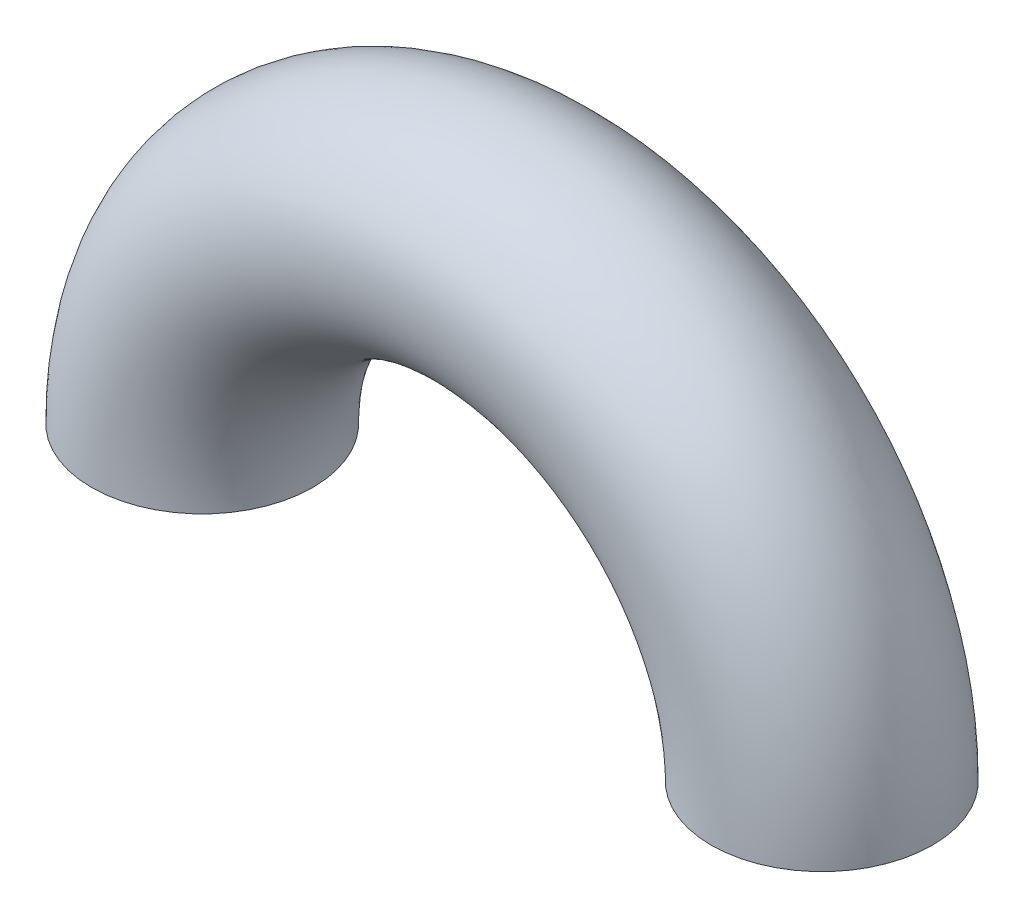
ISO-10303-21;
HEADER;
FILE_DESCRIPTION(('STEP AP214'),'2;1');
FILE_NAME('part.step','',(''),(''),'','','');
FILE_SCHEMA(('AUTOMOTIVE_DESIGN { 1 0 10303 214 1 1 1 1 }'));
ENDSEC;
DATA;
#1=APPLICATION_CONTEXT('core data for automotive mechanical design processes');
#2=APPLICATION_PROTOCOL_DEFINITION('international standard','automotive_design',2000,#1);
#3=PRODUCT_CONTEXT('',#1,'mechanical');
#4=PRODUCT('Part','Part','',(#3));
#5=PRODUCT_RELATED_PRODUCT_CATEGORY('part','',(#4));
#6=PRODUCT_DEFINITION_FORMATION('','',#4);
#7=PRODUCT_DEFINITION_CONTEXT('part definition',#1,'design');
#8=PRODUCT_DEFINITION('design','',#6,#7);
#9=PRODUCT_DEFINITION_SHAPE('','',#8);
#10=(LENGTH_UNIT() NAMED_UNIT(*) SI_UNIT(.MILLI.,.METRE.));
#11=(NAMED_UNIT(*) PLANE_ANGLE_UNIT() SI_UNIT($,.RADIAN.));
#12=(NAMED_UNIT(*) SI_UNIT($,.STERADIAN.) SOLID_ANGLE_UNIT());
#13=UNCERTAINTY_MEASURE_WITH_UNIT(LENGTH_MEASURE(1.E-05),#10,'distance_accuracy_value','');
#14=(GEOMETRIC_REPRESENTATION_CONTEXT(3) GLOBAL_UNCERTAINTY_ASSIGNED_CONTEXT((#13)) GLOBAL_UNIT_ASSIGNED_CONTEXT((#10,
#11,#12)) REPRESENTATION_CONTEXT('',''));
#15=CARTESIAN_POINT('',(0.,0.,0.));
#16=DIRECTION('',(0.,0.,1.));
#17=DIRECTION('',(1.,0.,0.));
#18=AXIS2_PLACEMENT_3D('',#15,#16,#17);
#19=CARTESIAN_POINT('',(-70.,0.,0.));
#20=DIRECTION('',(0.,0.,-1.));
#21=DIRECTION('',(-1.,0.,0.));
#22=AXIS2_PLACEMENT_3D('',#19,#20,#21);
#23=TOROIDAL_SURFACE('',#22,70.,25.);
#24=CARTESIAN_POINT('',(-140.,-4.88807387438039E-13,0.));
#25=DIRECTION('',(0.,-1.,0.));
#26=DIRECTION('',(0.,0.,1.));
#27=AXIS2_PLACEMENT_3D('',#24,#25,#26);
#28=CIRCLE('',#27,25.);
#29=CARTESIAN_POINT('',(-165.,-6.63381454380196E-13,0.));
#30=VERTEX_POINT('',#29);
#31=EDGE_CURVE('E10',#30,#30,#28,.T.);
#32=CARTESIAN_POINT('',(0.,0.,0.));
#33=DIRECTION('',(0.,1.,0.));
#34=DIRECTION('',(0.,0.,1.));
#35=AXIS2_PLACEMENT_3D('',#32,#33,#34);
#36=CIRCLE('',#35,25.);
#37=CARTESIAN_POINT('',(25.,0.,0.));
#38=VERTEX_POINT('',#37);
#39=EDGE_CURVE('E41',#38,#38,#36,.T.);
#40=CARTESIAN_POINT('',(-70.,0.,0.));
#41=DIRECTION('',(0.,0.,-1.));
#42=DIRECTION('',(-1.,0.,0.));
#43=AXIS2_PLACEMENT_3D('',#40,#41,#42);
#44=CIRCLE('',#43,95.);
#45=EDGE_CURVE('',#30,#38,#44,.T.);
#46=ORIENTED_EDGE('',*,*,#31,.F.);
#47=ORIENTED_EDGE('',*,*,#39,.T.);
#48=ORIENTED_EDGE('',*,*,#45,.T.);
#49=ORIENTED_EDGE('',*,*,#45,.F.);
#50=EDGE_LOOP('',(#46,#48,#47,#49));
#51=FACE_BOUND('',#50,.T.);
#52=ADVANCED_FACE('F35',(#51),#23,.T.);
#53=CARTESIAN_POINT('',(-140.,-4.88807387438039E-13,0.));
#54=DIRECTION('',(0.,-1.,0.));
#55=DIRECTION('',(0.,0.,1.));
#56=AXIS2_PLACEMENT_3D('',#53,#54,#55);
#57=PLANE('',#56);
#58=CARTESIAN_POINT('',(-140.,-4.88807387438039E-13,0.));
#59=DIRECTION('',(0.,-1.,0.));
#60=DIRECTION('',(-1.,0.,0.));
#61=AXIS2_PLACEMENT_3D('',#58,#59,#60);
#62=CIRCLE('',#61,20.);
#63=CARTESIAN_POINT('',(-160.,-6.28466640991764E-13,0.));
#64=VERTEX_POINT('',#63);
#65=EDGE_CURVE('E45',#64,#64,#62,.T.);
#66=ORIENTED_EDGE('',*,*,#65,.F.);
#67=EDGE_LOOP('',(#66));
#68=FACE_BOUND('',#67,.T.);
#69=ORIENTED_EDGE('',*,*,#31,.T.);
#70=EDGE_LOOP('',(#69));
#71=FACE_BOUND('',#70,.T.);
#72=ADVANCED_FACE('F65',(#68,#71),#57,.T.);
#73=CARTESIAN_POINT('',(0.,0.,0.));
#74=DIRECTION('',(0.,1.,0.));
#75=DIRECTION('',(0.,0.,1.));
#76=AXIS2_PLACEMENT_3D('',#73,#74,#75);
#77=PLANE('',#76);
#78=CARTESIAN_POINT('',(0.,0.,0.));
#79=DIRECTION('',(0.,1.,0.));
#80=DIRECTION('',(1.,0.,0.));
#81=AXIS2_PLACEMENT_3D('',#78,#79,#80);
#82=CIRCLE('',#81,20.);
#83=CARTESIAN_POINT('',(20.,0.,0.));
#84=VERTEX_POINT('',#83);
#85=EDGE_CURVE('E49',#84,#84,#82,.T.);
#86=ORIENTED_EDGE('',*,*,#85,.T.);
#87=EDGE_LOOP('',(#86));
#88=FACE_BOUND('',#87,.T.);
#89=ORIENTED_EDGE('',*,*,#39,.F.);
#90=EDGE_LOOP('',(#89));
#91=FACE_BOUND('',#90,.T.);
#92=ADVANCED_FACE('F55',(#88,#91),#77,.F.);
#93=CARTESIAN_POINT('',(-70.,0.,0.));
#94=DIRECTION('',(0.,0.,-1.));
#95=DIRECTION('',(-1.,0.,0.));
#96=AXIS2_PLACEMENT_3D('',#93,#94,#95);
#97=TOROIDAL_SURFACE('',#96,70.,20.);
#98=CARTESIAN_POINT('',(-70.,0.,0.));
#99=DIRECTION('',(0.,0.,-1.));
#100=DIRECTION('',(-1.,0.,0.));
#101=AXIS2_PLACEMENT_3D('',#98,#99,#100);
#102=CIRCLE('',#101,90.);
#103=EDGE_CURVE('',#64,#84,#102,.T.);
#104=ORIENTED_EDGE('',*,*,#65,.T.);
#105=ORIENTED_EDGE('',*,*,#85,.F.);
#106=ORIENTED_EDGE('',*,*,#103,.T.);
#107=ORIENTED_EDGE('',*,*,#103,.F.);
#108=EDGE_LOOP('',(#104,#106,#105,#107));
#109=FACE_BOUND('',#108,.T.);
#110=ADVANCED_FACE('F58',(#109),#97,.F.);
#111=CLOSED_SHELL('',(#52,#72,#92,#110));
#112=MANIFOLD_SOLID_BREP('B2',#111);
#113=ADVANCED_BREP_SHAPE_REPRESENTATION('',(#18,#112),#14);
#114=SHAPE_DEFINITION_REPRESENTATION(#9,#113);
ENDSEC;
END-ISO-10303-21;
